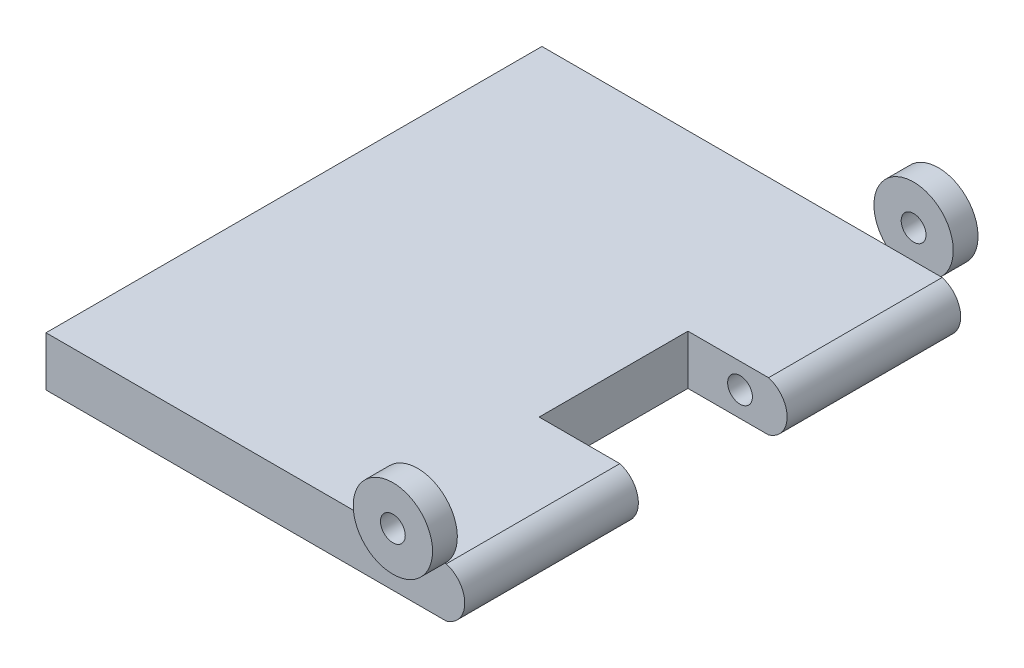
ISO-10303-21;
HEADER;
FILE_DESCRIPTION(('STEP AP214'),'2;1');
FILE_NAME('part.step','',(''),(''),'','','');
FILE_SCHEMA(('AUTOMOTIVE_DESIGN { 1 0 10303 214 1 1 1 1 }'));
ENDSEC;
DATA;
#1=APPLICATION_CONTEXT('core data for automotive mechanical design processes');
#2=APPLICATION_PROTOCOL_DEFINITION('international standard','automotive_design',2000,#1);
#3=PRODUCT_CONTEXT('',#1,'mechanical');
#4=PRODUCT('Part','Part','',(#3));
#5=PRODUCT_RELATED_PRODUCT_CATEGORY('part','',(#4));
#6=PRODUCT_DEFINITION_FORMATION('','',#4);
#7=PRODUCT_DEFINITION_CONTEXT('part definition',#1,'design');
#8=PRODUCT_DEFINITION('design','',#6,#7);
#9=PRODUCT_DEFINITION_SHAPE('','',#8);
#10=(LENGTH_UNIT() NAMED_UNIT(*) SI_UNIT(.MILLI.,.METRE.));
#11=(NAMED_UNIT(*) PLANE_ANGLE_UNIT() SI_UNIT($,.RADIAN.));
#12=(NAMED_UNIT(*) SI_UNIT($,.STERADIAN.) SOLID_ANGLE_UNIT());
#13=UNCERTAINTY_MEASURE_WITH_UNIT(LENGTH_MEASURE(1.E-05),#10,'distance_accuracy_value','');
#14=(GEOMETRIC_REPRESENTATION_CONTEXT(3) GLOBAL_UNCERTAINTY_ASSIGNED_CONTEXT((#13)) GLOBAL_UNIT_ASSIGNED_CONTEXT((#10,
#11,#12)) REPRESENTATION_CONTEXT('',''));
#15=CARTESIAN_POINT('',(0.,0.,0.));
#16=DIRECTION('',(0.,0.,1.));
#17=DIRECTION('',(1.,0.,0.));
#18=AXIS2_PLACEMENT_3D('',#15,#16,#17);
#19=CARTESIAN_POINT('',(0.,2.53999999999999,63.5));
#20=DIRECTION('',(0.,1.,0.));
#21=DIRECTION('',(0.,0.,1.));
#22=AXIS2_PLACEMENT_3D('',#19,#20,#21);
#23=PLANE('',#22);
#24=DIRECTION('',(0.,0.,-1.));
#25=VECTOR('',#24,1.);
#26=CARTESIAN_POINT('',(-15.0749,2.53999999999999,157.719939092823));
#27=LINE('',#26,#25);
#28=CARTESIAN_POINT('',(-15.0749,2.53999999999999,22.225));
#29=VERTEX_POINT('',#28);
#30=CARTESIAN_POINT('',(-15.0749,2.53999999999999,0.));
#31=VERTEX_POINT('',#30);
#32=EDGE_CURVE('E121',#29,#31,#27,.T.);
#33=ORIENTED_EDGE('',*,*,#32,.F.);
#34=DIRECTION('',(1.,0.,0.));
#35=VECTOR('',#34,1.);
#36=CARTESIAN_POINT('',(-25.4,2.53999999999999,22.225));
#37=LINE('',#36,#35);
#38=CARTESIAN_POINT('',(-25.4,2.53999999999999,22.225));
#39=VERTEX_POINT('',#38);
#40=EDGE_CURVE('E127',#39,#29,#37,.T.);
#41=ORIENTED_EDGE('',*,*,#40,.F.);
#42=DIRECTION('',(0.,0.,-1.));
#43=VECTOR('',#42,1.);
#44=CARTESIAN_POINT('',(-25.4,2.53999999999999,41.275));
#45=LINE('',#44,#43);
#46=CARTESIAN_POINT('',(-25.4,2.53999999999999,41.275));
#47=VERTEX_POINT('',#46);
#48=EDGE_CURVE('E206',#47,#39,#45,.T.);
#49=ORIENTED_EDGE('',*,*,#48,.F.);
#50=DIRECTION('',(1.,0.,0.));
#51=VECTOR('',#50,1.);
#52=CARTESIAN_POINT('',(-25.4,2.53999999999999,41.275));
#53=LINE('',#52,#51);
#54=CARTESIAN_POINT('',(-15.0680974778368,2.53999999999999,41.275));
#55=VERTEX_POINT('',#54);
#56=EDGE_CURVE('E220',#47,#55,#53,.T.);
#57=ORIENTED_EDGE('',*,*,#56,.T.);
#58=DIRECTION('',(0.,0.,1.));
#59=VECTOR('',#58,1.);
#60=CARTESIAN_POINT('',(-15.0680974778368,2.53999999999999,-122.001189092823));
#61=LINE('',#60,#59);
#62=CARTESIAN_POINT('',(-15.0680974778368,2.53999999999999,63.5));
#63=VERTEX_POINT('',#62);
#64=EDGE_CURVE('E155',#55,#63,#61,.T.);
#65=ORIENTED_EDGE('',*,*,#64,.T.);
#66=DIRECTION('',(1.,0.,0.));
#67=VECTOR('',#66,1.);
#68=CARTESIAN_POINT('',(0.,2.53999999999999,63.5));
#69=LINE('',#68,#67);
#70=CARTESIAN_POINT('',(-66.3215790526734,2.53999999999999,63.5));
#71=VERTEX_POINT('',#70);
#72=EDGE_CURVE('E230',#71,#63,#69,.T.);
#73=ORIENTED_EDGE('',*,*,#72,.F.);
#74=DIRECTION('',(0.,0.,-1.));
#75=VECTOR('',#74,1.);
#76=CARTESIAN_POINT('',(-66.3215790526734,2.53999999999999,63.5));
#77=LINE('',#76,#75);
#78=CARTESIAN_POINT('',(-66.3215790526734,2.53999999999999,0.));
#79=VERTEX_POINT('',#78);
#80=EDGE_CURVE('E47',#71,#79,#77,.T.);
#81=ORIENTED_EDGE('',*,*,#80,.T.);
#82=DIRECTION('',(1.,0.,0.));
#83=VECTOR('',#82,1.);
#84=CARTESIAN_POINT('',(0.,2.53999999999999,0.));
#85=LINE('',#84,#83);
#86=EDGE_CURVE('E139',#79,#31,#85,.T.);
#87=ORIENTED_EDGE('',*,*,#86,.T.);
#88=EDGE_LOOP('',(#33,#41,#49,#57,#65,#73,#81,#87));
#89=FACE_BOUND('',#88,.T.);
#90=ADVANCED_FACE('F39',(#89),#23,.F.);
#91=CARTESIAN_POINT('',(-66.3215790526734,8.88999999999999,63.5));
#92=DIRECTION('',(0.,-1.,0.));
#93=DIRECTION('',(0.,0.,-1.));
#94=AXIS2_PLACEMENT_3D('',#91,#92,#93);
#95=PLANE('',#94);
#96=DIRECTION('',(1.,0.,0.));
#97=VECTOR('',#96,1.);
#98=CARTESIAN_POINT('',(-25.4,8.88999999999999,22.225));
#99=LINE('',#98,#97);
#100=CARTESIAN_POINT('',(-25.4,8.88999999999999,22.225));
#101=VERTEX_POINT('',#100);
#102=CARTESIAN_POINT('',(-15.0749,8.88999999999999,22.225));
#103=VERTEX_POINT('',#102);
#104=EDGE_CURVE('E135',#101,#103,#99,.T.);
#105=ORIENTED_EDGE('',*,*,#104,.T.);
#106=DIRECTION('',(0.,0.,-1.));
#107=VECTOR('',#106,1.);
#108=CARTESIAN_POINT('',(-15.0749,8.88999999999999,157.719939092823));
#109=LINE('',#108,#107);
#110=CARTESIAN_POINT('',(-15.0749,8.88999999999999,0.));
#111=VERTEX_POINT('',#110);
#112=EDGE_CURVE('E54',#103,#111,#109,.T.);
#113=ORIENTED_EDGE('',*,*,#112,.T.);
#114=DIRECTION('',(-1.,0.,0.));
#115=VECTOR('',#114,1.);
#116=CARTESIAN_POINT('',(-66.3215790526734,8.88999999999999,0.));
#117=LINE('',#116,#115);
#118=CARTESIAN_POINT('',(-15.2336557622552,8.88999999999999,0.));
#119=VERTEX_POINT('',#118);
#120=EDGE_CURVE('E246',#111,#119,#117,.T.);
#121=ORIENTED_EDGE('',*,*,#120,.T.);
#122=CARTESIAN_POINT('',(-22.2313442377448,8.88999999999999,0.));
#123=VERTEX_POINT('',#122);
#124=EDGE_CURVE('E249',#119,#123,#117,.T.);
#125=ORIENTED_EDGE('',*,*,#124,.T.);
#126=CARTESIAN_POINT('',(-66.3215790526734,8.88999999999999,0.));
#127=VERTEX_POINT('',#126);
#128=EDGE_CURVE('E245',#123,#127,#117,.T.);
#129=ORIENTED_EDGE('',*,*,#128,.T.);
#130=DIRECTION('',(0.,0.,-1.));
#131=VECTOR('',#130,1.);
#132=CARTESIAN_POINT('',(-66.3215790526734,8.88999999999999,63.5));
#133=LINE('',#132,#131);
#134=CARTESIAN_POINT('',(-66.3215790526734,8.88999999999999,63.5));
#135=VERTEX_POINT('',#134);
#136=EDGE_CURVE('E11',#135,#127,#133,.T.);
#137=ORIENTED_EDGE('',*,*,#136,.F.);
#138=DIRECTION('',(-1.,0.,0.));
#139=VECTOR('',#138,1.);
#140=CARTESIAN_POINT('',(-66.3215790526734,8.88999999999999,63.5));
#141=LINE('',#140,#139);
#142=CARTESIAN_POINT('',(-22.2313442377448,8.88999999999999,63.5));
#143=VERTEX_POINT('',#142);
#144=EDGE_CURVE('E234',#143,#135,#141,.T.);
#145=ORIENTED_EDGE('',*,*,#144,.F.);
#146=CARTESIAN_POINT('',(-15.2336557622552,8.88999999999999,63.5));
#147=VERTEX_POINT('',#146);
#148=EDGE_CURVE('E240',#147,#143,#141,.T.);
#149=ORIENTED_EDGE('',*,*,#148,.F.);
#150=CARTESIAN_POINT('',(-15.0680974778368,8.88999999999999,63.5));
#151=VERTEX_POINT('',#150);
#152=EDGE_CURVE('E236',#151,#147,#141,.T.);
#153=ORIENTED_EDGE('',*,*,#152,.F.);
#154=DIRECTION('',(0.,0.,1.));
#155=VECTOR('',#154,1.);
#156=CARTESIAN_POINT('',(-15.0680974778368,8.88999999999999,-122.001189092823));
#157=LINE('',#156,#155);
#158=CARTESIAN_POINT('',(-15.0680974778368,8.88999999999999,41.275));
#159=VERTEX_POINT('',#158);
#160=EDGE_CURVE('E150',#159,#151,#157,.T.);
#161=ORIENTED_EDGE('',*,*,#160,.F.);
#162=DIRECTION('',(1.,0.,0.));
#163=VECTOR('',#162,1.);
#164=CARTESIAN_POINT('',(-25.4,8.88999999999999,41.275));
#165=LINE('',#164,#163);
#166=CARTESIAN_POINT('',(-25.4,8.88999999999999,41.275));
#167=VERTEX_POINT('',#166);
#168=EDGE_CURVE('E224',#167,#159,#165,.T.);
#169=ORIENTED_EDGE('',*,*,#168,.F.);
#170=DIRECTION('',(0.,0.,1.));
#171=VECTOR('',#170,1.);
#172=CARTESIAN_POINT('',(-25.4,8.88999999999999,41.275));
#173=LINE('',#172,#171);
#174=EDGE_CURVE('E214',#101,#167,#173,.T.);
#175=ORIENTED_EDGE('',*,*,#174,.F.);
#176=EDGE_LOOP('',(#105,#113,#121,#125,#129,#137,#145,#149,#153,#161,#169,#175));
#177=FACE_BOUND('',#176,.T.);
#178=ADVANCED_FACE('F264',(#177),#95,.F.);
#179=CARTESIAN_POINT('',(0.,0.,63.5));
#180=DIRECTION('',(0.,0.,-1.));
#181=DIRECTION('',(-1.,0.,0.));
#182=AXIS2_PLACEMENT_3D('',#179,#180,#181);
#183=PLANE('',#182);
#184=CARTESIAN_POINT('',(-16.0124714694743,5.71499999999999,63.5));
#185=DIRECTION('',(0.,0.,1.));
#186=DIRECTION('',(1.,0.,0.));
#187=AXIS2_PLACEMENT_3D('',#184,#185,#186);
#188=CIRCLE('',#187,3.31247146947434);
#189=EDGE_CURVE('E145',#151,#63,#188,.F.);
#190=ORIENTED_EDGE('',*,*,#189,.F.);
#191=ORIENTED_EDGE('',*,*,#152,.T.);
#192=CARTESIAN_POINT('',(-18.7325,12.573,63.5));
#193=DIRECTION('',(0.,0.,1.));
#194=DIRECTION('',(1.,0.,0.));
#195=AXIS2_PLACEMENT_3D('',#192,#193,#194);
#196=CIRCLE('',#195,5.08);
#197=EDGE_CURVE('E190',#143,#147,#196,.T.);
#198=ORIENTED_EDGE('',*,*,#197,.F.);
#199=ORIENTED_EDGE('',*,*,#144,.T.);
#200=DIRECTION('',(0.,-1.,0.));
#201=VECTOR('',#200,1.);
#202=CARTESIAN_POINT('',(-66.3215790526734,2.53999999999999,63.5));
#203=LINE('',#202,#201);
#204=EDGE_CURVE('E239',#135,#71,#203,.T.);
#205=ORIENTED_EDGE('',*,*,#204,.T.);
#206=ORIENTED_EDGE('',*,*,#72,.T.);
#207=EDGE_LOOP('',(#190,#191,#198,#199,#205,#206));
#208=FACE_BOUND('',#207,.T.);
#209=ADVANCED_FACE('F310',(#208),#183,.F.);
#210=CARTESIAN_POINT('',(-66.3215790526734,2.53999999999999,63.5));
#211=DIRECTION('',(1.,0.,0.));
#212=DIRECTION('',(0.,1.,0.));
#213=AXIS2_PLACEMENT_3D('',#210,#211,#212);
#214=PLANE('',#213);
#215=DIRECTION('',(0.,-1.,0.));
#216=VECTOR('',#215,1.);
#217=CARTESIAN_POINT('',(-66.3215790526734,2.53999999999999,0.));
#218=LINE('',#217,#216);
#219=EDGE_CURVE('E235',#127,#79,#218,.T.);
#220=ORIENTED_EDGE('',*,*,#219,.T.);
#221=ORIENTED_EDGE('',*,*,#80,.F.);
#222=ORIENTED_EDGE('',*,*,#204,.F.);
#223=ORIENTED_EDGE('',*,*,#136,.T.);
#224=EDGE_LOOP('',(#220,#221,#222,#223));
#225=FACE_BOUND('',#224,.T.);
#226=ADVANCED_FACE('F261',(#225),#214,.F.);
#227=CARTESIAN_POINT('',(0.,0.,0.));
#228=DIRECTION('',(0.,0.,-1.));
#229=DIRECTION('',(-1.,0.,0.));
#230=AXIS2_PLACEMENT_3D('',#227,#228,#229);
#231=PLANE('',#230);
#232=ORIENTED_EDGE('',*,*,#120,.F.);
#233=CARTESIAN_POINT('',(-16.0097762032086,5.71499999999999,0.));
#234=DIRECTION('',(0.,0.,-1.));
#235=DIRECTION('',(-1.,0.,0.));
#236=AXIS2_PLACEMENT_3D('',#233,#234,#235);
#237=CIRCLE('',#236,3.30977620320856);
#238=EDGE_CURVE('E61',#111,#31,#237,.T.);
#239=ORIENTED_EDGE('',*,*,#238,.T.);
#240=ORIENTED_EDGE('',*,*,#86,.F.);
#241=ORIENTED_EDGE('',*,*,#219,.F.);
#242=ORIENTED_EDGE('',*,*,#128,.F.);
#243=CARTESIAN_POINT('',(-18.7325,12.573,0.));
#244=DIRECTION('',(0.,0.,-1.));
#245=DIRECTION('',(-1.,0.,0.));
#246=AXIS2_PLACEMENT_3D('',#243,#244,#245);
#247=CIRCLE('',#246,5.08);
#248=EDGE_CURVE('E173',#119,#123,#247,.T.);
#249=ORIENTED_EDGE('',*,*,#248,.F.);
#250=EDGE_LOOP('',(#232,#239,#240,#241,#242,#249));
#251=FACE_BOUND('',#250,.T.);
#252=ADVANCED_FACE('F257',(#251),#231,.T.);
#253=CARTESIAN_POINT('',(-25.4,8.88999999999999,41.275));
#254=DIRECTION('',(0.,0.,1.));
#255=DIRECTION('',(1.,0.,0.));
#256=AXIS2_PLACEMENT_3D('',#253,#254,#255);
#257=PLANE('',#256);
#258=CARTESIAN_POINT('',(-18.7325,5.71499999999999,41.275));
#259=DIRECTION('',(0.,0.,-1.));
#260=DIRECTION('',(-1.,0.,0.));
#261=AXIS2_PLACEMENT_3D('',#258,#259,#260);
#262=CIRCLE('',#261,1.5875);
#263=CARTESIAN_POINT('',(-20.32,5.71499999999999,41.275));
#264=VERTEX_POINT('',#263);
#265=EDGE_CURVE('E198',#264,#264,#262,.T.);
#266=ORIENTED_EDGE('',*,*,#265,.F.);
#267=EDGE_LOOP('',(#266));
#268=FACE_BOUND('',#267,.T.);
#269=ORIENTED_EDGE('',*,*,#168,.T.);
#270=CARTESIAN_POINT('',(-16.0124714694743,5.71499999999999,41.275));
#271=DIRECTION('',(0.,0.,1.));
#272=DIRECTION('',(1.,0.,0.));
#273=AXIS2_PLACEMENT_3D('',#270,#271,#272);
#274=CIRCLE('',#273,3.31247146947434);
#275=EDGE_CURVE('E141',#159,#55,#274,.F.);
#276=ORIENTED_EDGE('',*,*,#275,.T.);
#277=ORIENTED_EDGE('',*,*,#56,.F.);
#278=DIRECTION('',(0.,-1.,0.));
#279=VECTOR('',#278,1.);
#280=CARTESIAN_POINT('',(-25.4,8.88999999999999,41.275));
#281=LINE('',#280,#279);
#282=EDGE_CURVE('E136',#167,#47,#281,.T.);
#283=ORIENTED_EDGE('',*,*,#282,.F.);
#284=EDGE_LOOP('',(#269,#276,#277,#283));
#285=FACE_BOUND('',#284,.T.);
#286=ADVANCED_FACE('F320',(#268,#285),#257,.F.);
#287=CARTESIAN_POINT('',(-25.4,2.53999999999999,22.225));
#288=DIRECTION('',(0.,0.,-1.));
#289=DIRECTION('',(-1.,0.,0.));
#290=AXIS2_PLACEMENT_3D('',#287,#288,#289);
#291=PLANE('',#290);
#292=CARTESIAN_POINT('',(-16.0097762032086,5.71499999999999,22.225));
#293=DIRECTION('',(0.,0.,-1.));
#294=DIRECTION('',(-1.,0.,0.));
#295=AXIS2_PLACEMENT_3D('',#292,#293,#294);
#296=CIRCLE('',#295,3.30977620320856);
#297=EDGE_CURVE('E117',#103,#29,#296,.T.);
#298=ORIENTED_EDGE('',*,*,#297,.F.);
#299=ORIENTED_EDGE('',*,*,#104,.F.);
#300=DIRECTION('',(0.,1.,0.));
#301=VECTOR('',#300,1.);
#302=CARTESIAN_POINT('',(-25.4,2.53999999999999,22.225));
#303=LINE('',#302,#301);
#304=EDGE_CURVE('E130',#39,#101,#303,.T.);
#305=ORIENTED_EDGE('',*,*,#304,.F.);
#306=ORIENTED_EDGE('',*,*,#40,.T.);
#307=EDGE_LOOP('',(#298,#299,#305,#306));
#308=FACE_BOUND('',#307,.T.);
#309=CARTESIAN_POINT('',(-18.7325,5.71499999999999,22.225));
#310=DIRECTION('',(0.,0.,1.));
#311=DIRECTION('',(1.,0.,0.));
#312=AXIS2_PLACEMENT_3D('',#309,#310,#311);
#313=CIRCLE('',#312,1.5875);
#314=CARTESIAN_POINT('',(-17.145,5.71499999999999,22.225));
#315=VERTEX_POINT('',#314);
#316=EDGE_CURVE('E189',#315,#315,#313,.T.);
#317=ORIENTED_EDGE('',*,*,#316,.F.);
#318=EDGE_LOOP('',(#317));
#319=FACE_BOUND('',#318,.T.);
#320=ADVANCED_FACE('F128',(#308,#319),#291,.F.);
#321=CARTESIAN_POINT('',(-25.4,0.,0.));
#322=DIRECTION('',(1.,0.,0.));
#323=DIRECTION('',(0.,0.,-1.));
#324=AXIS2_PLACEMENT_3D('',#321,#322,#323);
#325=PLANE('',#324);
#326=ORIENTED_EDGE('',*,*,#48,.T.);
#327=ORIENTED_EDGE('',*,*,#304,.T.);
#328=ORIENTED_EDGE('',*,*,#174,.T.);
#329=ORIENTED_EDGE('',*,*,#282,.T.);
#330=EDGE_LOOP('',(#326,#327,#328,#329));
#331=FACE_BOUND('',#330,.T.);
#332=ADVANCED_FACE('F324',(#331),#325,.T.);
#333=CARTESIAN_POINT('',(-18.7325,5.71499999999999,53.975));
#334=DIRECTION('',(0.,0.,-1.));
#335=DIRECTION('',(-1.,0.,0.));
#336=AXIS2_PLACEMENT_3D('',#333,#334,#335);
#337=CYLINDRICAL_SURFACE('',#336,1.5875);
#338=CARTESIAN_POINT('',(-18.7325,5.71499999999999,53.975));
#339=DIRECTION('',(0.,0.,-1.));
#340=DIRECTION('',(-1.,0.,0.));
#341=AXIS2_PLACEMENT_3D('',#338,#339,#340);
#342=CIRCLE('',#341,1.5875);
#343=CARTESIAN_POINT('',(-20.32,5.71499999999999,53.975));
#344=VERTEX_POINT('',#343);
#345=EDGE_CURVE('E202',#344,#344,#342,.T.);
#346=ORIENTED_EDGE('',*,*,#345,.F.);
#347=EDGE_LOOP('',(#346));
#348=FACE_BOUND('',#347,.T.);
#349=ORIENTED_EDGE('',*,*,#265,.T.);
#350=EDGE_LOOP('',(#349));
#351=FACE_BOUND('',#350,.T.);
#352=ADVANCED_FACE('F330',(#348,#351),#337,.F.);
#353=CARTESIAN_POINT('',(-18.7325,5.71499999999999,53.975));
#354=DIRECTION('',(0.,0.,-1.));
#355=DIRECTION('',(-1.,0.,0.));
#356=AXIS2_PLACEMENT_3D('',#353,#354,#355);
#357=PLANE('',#356);
#358=ORIENTED_EDGE('',*,*,#345,.T.);
#359=EDGE_LOOP('',(#358));
#360=FACE_BOUND('',#359,.T.);
#361=ADVANCED_FACE('F334',(#360),#357,.T.);
#362=CARTESIAN_POINT('',(-18.7325,5.71499999999999,9.525));
#363=DIRECTION('',(0.,0.,1.));
#364=DIRECTION('',(1.,0.,0.));
#365=AXIS2_PLACEMENT_3D('',#362,#363,#364);
#366=CYLINDRICAL_SURFACE('',#365,1.5875);
#367=CARTESIAN_POINT('',(-18.7325,5.71499999999999,9.525));
#368=DIRECTION('',(0.,0.,1.));
#369=DIRECTION('',(1.,0.,0.));
#370=AXIS2_PLACEMENT_3D('',#367,#368,#369);
#371=CIRCLE('',#370,1.5875);
#372=CARTESIAN_POINT('',(-17.145,5.71499999999999,9.525));
#373=VERTEX_POINT('',#372);
#374=EDGE_CURVE('E194',#373,#373,#371,.T.);
#375=ORIENTED_EDGE('',*,*,#374,.F.);
#376=EDGE_LOOP('',(#375));
#377=FACE_BOUND('',#376,.T.);
#378=ORIENTED_EDGE('',*,*,#316,.T.);
#379=EDGE_LOOP('',(#378));
#380=FACE_BOUND('',#379,.T.);
#381=ADVANCED_FACE('F338',(#377,#380),#366,.F.);
#382=CARTESIAN_POINT('',(-18.7325,5.71499999999999,9.525));
#383=DIRECTION('',(0.,0.,1.));
#384=DIRECTION('',(1.,0.,0.));
#385=AXIS2_PLACEMENT_3D('',#382,#383,#384);
#386=PLANE('',#385);
#387=ORIENTED_EDGE('',*,*,#374,.T.);
#388=EDGE_LOOP('',(#387));
#389=FACE_BOUND('',#388,.T.);
#390=ADVANCED_FACE('F342',(#389),#386,.T.);
#391=CARTESIAN_POINT('',(-18.7325,12.573,63.5));
#392=DIRECTION('',(0.,0.,1.));
#393=DIRECTION('',(1.,0.,0.));
#394=AXIS2_PLACEMENT_3D('',#391,#392,#393);
#395=PLANE('',#394);
#396=CARTESIAN_POINT('',(-18.7325,12.573,63.5));
#397=DIRECTION('',(0.,0.,1.));
#398=DIRECTION('',(1.,0.,0.));
#399=AXIS2_PLACEMENT_3D('',#396,#397,#398);
#400=CIRCLE('',#399,1.5875);
#401=CARTESIAN_POINT('',(-17.145,12.573,63.5));
#402=VERTEX_POINT('',#401);
#403=EDGE_CURVE('E172',#402,#402,#400,.T.);
#404=ORIENTED_EDGE('',*,*,#403,.T.);
#405=EDGE_LOOP('',(#404));
#406=FACE_BOUND('',#405,.T.);
#407=EDGE_CURVE('E181',#147,#143,#196,.T.);
#408=ORIENTED_EDGE('',*,*,#407,.F.);
#409=ORIENTED_EDGE('',*,*,#148,.T.);
#410=EDGE_LOOP('',(#408,#409));
#411=FACE_BOUND('',#410,.T.);
#412=ADVANCED_FACE('F275',(#406,#411),#395,.F.);
#413=CARTESIAN_POINT('',(-18.7325,12.573,66.675));
#414=DIRECTION('',(0.,0.,1.));
#415=DIRECTION('',(1.,0.,0.));
#416=AXIS2_PLACEMENT_3D('',#413,#414,#415);
#417=PLANE('',#416);
#418=CARTESIAN_POINT('',(-18.7325,12.573,66.675));
#419=DIRECTION('',(0.,0.,1.));
#420=DIRECTION('',(1.,0.,0.));
#421=AXIS2_PLACEMENT_3D('',#418,#419,#420);
#422=CIRCLE('',#421,5.08);
#423=CARTESIAN_POINT('',(-13.6525,12.573,66.675));
#424=VERTEX_POINT('',#423);
#425=EDGE_CURVE('E185',#424,#424,#422,.T.);
#426=ORIENTED_EDGE('',*,*,#425,.T.);
#427=EDGE_LOOP('',(#426));
#428=FACE_BOUND('',#427,.T.);
#429=CARTESIAN_POINT('',(-18.7325,12.573,66.675));
#430=DIRECTION('',(0.,0.,1.));
#431=DIRECTION('',(1.,0.,0.));
#432=AXIS2_PLACEMENT_3D('',#429,#430,#431);
#433=CIRCLE('',#432,1.5875);
#434=CARTESIAN_POINT('',(-17.145,12.573,66.675));
#435=VERTEX_POINT('',#434);
#436=EDGE_CURVE('E177',#435,#435,#433,.T.);
#437=ORIENTED_EDGE('',*,*,#436,.F.);
#438=EDGE_LOOP('',(#437));
#439=FACE_BOUND('',#438,.T.);
#440=ADVANCED_FACE('F350',(#428,#439),#417,.T.);
#441=CARTESIAN_POINT('',(-18.7325,12.573,66.675));
#442=DIRECTION('',(0.,0.,-1.));
#443=DIRECTION('',(-1.,0.,0.));
#444=AXIS2_PLACEMENT_3D('',#441,#442,#443);
#445=CYLINDRICAL_SURFACE('',#444,5.08);
#446=ORIENTED_EDGE('',*,*,#425,.F.);
#447=EDGE_LOOP('',(#446));
#448=FACE_BOUND('',#447,.T.);
#449=ORIENTED_EDGE('',*,*,#197,.T.);
#450=ORIENTED_EDGE('',*,*,#407,.T.);
#451=EDGE_LOOP('',(#449,#450));
#452=FACE_BOUND('',#451,.T.);
#453=ADVANCED_FACE('F278',(#448,#452),#445,.T.);
#454=CARTESIAN_POINT('',(-18.7325,12.573,66.675));
#455=DIRECTION('',(0.,0.,-1.));
#456=DIRECTION('',(-1.,0.,0.));
#457=AXIS2_PLACEMENT_3D('',#454,#455,#456);
#458=CYLINDRICAL_SURFACE('',#457,1.5875);
#459=ORIENTED_EDGE('',*,*,#436,.T.);
#460=EDGE_LOOP('',(#459));
#461=FACE_BOUND('',#460,.T.);
#462=ORIENTED_EDGE('',*,*,#403,.F.);
#463=EDGE_LOOP('',(#462));
#464=FACE_BOUND('',#463,.T.);
#465=ADVANCED_FACE('F349',(#461,#464),#458,.F.);
#466=CARTESIAN_POINT('',(-18.7325,12.573,-3.175));
#467=DIRECTION('',(0.,0.,-1.));
#468=DIRECTION('',(-1.,0.,0.));
#469=AXIS2_PLACEMENT_3D('',#466,#467,#468);
#470=PLANE('',#469);
#471=CARTESIAN_POINT('',(-18.7325,12.573,-3.175));
#472=DIRECTION('',(0.,0.,-1.));
#473=DIRECTION('',(-1.,0.,0.));
#474=AXIS2_PLACEMENT_3D('',#471,#472,#473);
#475=CIRCLE('',#474,5.08);
#476=CARTESIAN_POINT('',(-23.8125,12.573,-3.175));
#477=VERTEX_POINT('',#476);
#478=EDGE_CURVE('E168',#477,#477,#475,.T.);
#479=ORIENTED_EDGE('',*,*,#478,.T.);
#480=EDGE_LOOP('',(#479));
#481=FACE_BOUND('',#480,.T.);
#482=CARTESIAN_POINT('',(-18.7325,12.573,-3.175));
#483=DIRECTION('',(0.,0.,-1.));
#484=DIRECTION('',(-1.,0.,0.));
#485=AXIS2_PLACEMENT_3D('',#482,#483,#484);
#486=CIRCLE('',#485,1.5875);
#487=CARTESIAN_POINT('',(-20.32,12.573,-3.175));
#488=VERTEX_POINT('',#487);
#489=EDGE_CURVE('E160',#488,#488,#486,.T.);
#490=ORIENTED_EDGE('',*,*,#489,.F.);
#491=EDGE_LOOP('',(#490));
#492=FACE_BOUND('',#491,.T.);
#493=ADVANCED_FACE('F288',(#481,#492),#470,.T.);
#494=CARTESIAN_POINT('',(-18.7325,12.573,0.));
#495=DIRECTION('',(0.,0.,-1.));
#496=DIRECTION('',(-1.,0.,0.));
#497=AXIS2_PLACEMENT_3D('',#494,#495,#496);
#498=PLANE('',#497);
#499=ORIENTED_EDGE('',*,*,#124,.F.);
#500=EDGE_CURVE('E164',#123,#119,#247,.T.);
#501=ORIENTED_EDGE('',*,*,#500,.F.);
#502=EDGE_LOOP('',(#499,#501));
#503=FACE_BOUND('',#502,.T.);
#504=CARTESIAN_POINT('',(-18.7325,12.573,0.));
#505=DIRECTION('',(0.,0.,-1.));
#506=DIRECTION('',(-1.,0.,0.));
#507=AXIS2_PLACEMENT_3D('',#504,#505,#506);
#508=CIRCLE('',#507,1.5875);
#509=CARTESIAN_POINT('',(-20.32,12.573,0.));
#510=VERTEX_POINT('',#509);
#511=EDGE_CURVE('E159',#510,#510,#508,.T.);
#512=ORIENTED_EDGE('',*,*,#511,.T.);
#513=EDGE_LOOP('',(#512));
#514=FACE_BOUND('',#513,.T.);
#515=ADVANCED_FACE('F285',(#503,#514),#498,.F.);
#516=CARTESIAN_POINT('',(-18.7325,12.573,-3.175));
#517=DIRECTION('',(0.,0.,1.));
#518=DIRECTION('',(1.,0.,0.));
#519=AXIS2_PLACEMENT_3D('',#516,#517,#518);
#520=CYLINDRICAL_SURFACE('',#519,5.08);
#521=ORIENTED_EDGE('',*,*,#478,.F.);
#522=EDGE_LOOP('',(#521));
#523=FACE_BOUND('',#522,.T.);
#524=ORIENTED_EDGE('',*,*,#248,.T.);
#525=ORIENTED_EDGE('',*,*,#500,.T.);
#526=EDGE_LOOP('',(#524,#525));
#527=FACE_BOUND('',#526,.T.);
#528=ADVANCED_FACE('F283',(#523,#527),#520,.T.);
#529=CARTESIAN_POINT('',(-18.7325,12.573,-3.175));
#530=DIRECTION('',(0.,0.,1.));
#531=DIRECTION('',(1.,0.,0.));
#532=AXIS2_PLACEMENT_3D('',#529,#530,#531);
#533=CYLINDRICAL_SURFACE('',#532,1.5875);
#534=ORIENTED_EDGE('',*,*,#489,.T.);
#535=EDGE_LOOP('',(#534));
#536=FACE_BOUND('',#535,.T.);
#537=ORIENTED_EDGE('',*,*,#511,.F.);
#538=EDGE_LOOP('',(#537));
#539=FACE_BOUND('',#538,.T.);
#540=ADVANCED_FACE('F292',(#536,#539),#533,.F.);
#541=CARTESIAN_POINT('',(-16.0124714694743,5.71499999999999,-122.001189092823));
#542=DIRECTION('',(0.,0.,1.));
#543=DIRECTION('',(1.,0.,0.));
#544=AXIS2_PLACEMENT_3D('',#541,#542,#543);
#545=CYLINDRICAL_SURFACE('',#544,3.31247146947434);
#546=ORIENTED_EDGE('',*,*,#64,.F.);
#547=ORIENTED_EDGE('',*,*,#275,.F.);
#548=ORIENTED_EDGE('',*,*,#160,.T.);
#549=ORIENTED_EDGE('',*,*,#189,.T.);
#550=EDGE_LOOP('',(#546,#547,#548,#549));
#551=FACE_BOUND('',#550,.T.);
#552=ADVANCED_FACE('F294',(#551),#545,.T.);
#553=CARTESIAN_POINT('',(-16.0097762032086,5.71499999999999,157.719939092823));
#554=DIRECTION('',(0.,0.,-1.));
#555=DIRECTION('',(-1.,0.,0.));
#556=AXIS2_PLACEMENT_3D('',#553,#554,#555);
#557=CYLINDRICAL_SURFACE('',#556,3.30977620320856);
#558=ORIENTED_EDGE('',*,*,#297,.T.);
#559=ORIENTED_EDGE('',*,*,#32,.T.);
#560=ORIENTED_EDGE('',*,*,#238,.F.);
#561=ORIENTED_EDGE('',*,*,#112,.F.);
#562=EDGE_LOOP('',(#558,#559,#560,#561));
#563=FACE_BOUND('',#562,.T.);
#564=ADVANCED_FACE('F119',(#563),#557,.T.);
#565=CLOSED_SHELL('',(#90,#178,#209,#226,#252,#286,#320,#332,#352,#361,#381,#390,#412,#440,#453,
#465,#493,#515,#528,#540,#552,#564));
#566=MANIFOLD_SOLID_BREP('B2',#565);
#567=ADVANCED_BREP_SHAPE_REPRESENTATION('',(#18,#566),#14);
#568=SHAPE_DEFINITION_REPRESENTATION(#9,#567);
ENDSEC;
END-ISO-10303-21;
